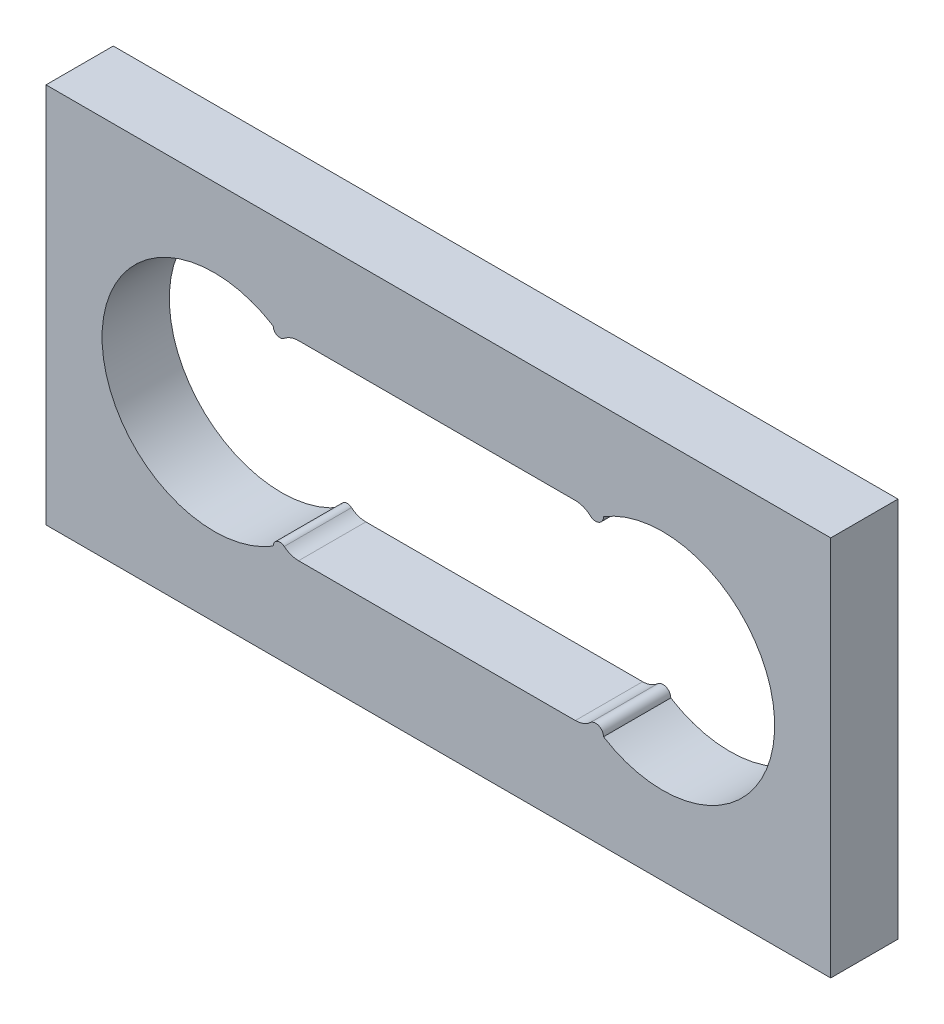
ISO-10303-21;
HEADER;
FILE_DESCRIPTION(('STEP AP214'),'2;1');
FILE_NAME('part.step','',(''),(''),'','','');
FILE_SCHEMA(('AUTOMOTIVE_DESIGN { 1 0 10303 214 1 1 1 1 }'));
ENDSEC;
DATA;
#1=APPLICATION_CONTEXT('core data for automotive mechanical design processes');
#2=APPLICATION_PROTOCOL_DEFINITION('international standard','automotive_design',2000,#1);
#3=PRODUCT_CONTEXT('',#1,'mechanical');
#4=PRODUCT('Part','Part','',(#3));
#5=PRODUCT_RELATED_PRODUCT_CATEGORY('part','',(#4));
#6=PRODUCT_DEFINITION_FORMATION('','',#4);
#7=PRODUCT_DEFINITION_CONTEXT('part definition',#1,'design');
#8=PRODUCT_DEFINITION('design','',#6,#7);
#9=PRODUCT_DEFINITION_SHAPE('','',#8);
#10=(LENGTH_UNIT() NAMED_UNIT(*) SI_UNIT(.MILLI.,.METRE.));
#11=(NAMED_UNIT(*) PLANE_ANGLE_UNIT() SI_UNIT($,.RADIAN.));
#12=(NAMED_UNIT(*) SI_UNIT($,.STERADIAN.) SOLID_ANGLE_UNIT());
#13=UNCERTAINTY_MEASURE_WITH_UNIT(LENGTH_MEASURE(1.E-05),#10,'distance_accuracy_value','');
#14=(GEOMETRIC_REPRESENTATION_CONTEXT(3) GLOBAL_UNCERTAINTY_ASSIGNED_CONTEXT((#13)) GLOBAL_UNIT_ASSIGNED_CONTEXT((#10,
#11,#12)) REPRESENTATION_CONTEXT('',''));
#15=CARTESIAN_POINT('',(0.,0.,0.));
#16=DIRECTION('',(0.,0.,1.));
#17=DIRECTION('',(1.,0.,0.));
#18=AXIS2_PLACEMENT_3D('',#15,#16,#17);
#19=CARTESIAN_POINT('',(0.,-8.5,3.));
#20=DIRECTION('',(0.,1.,0.));
#21=DIRECTION('',(0.,0.,1.));
#22=AXIS2_PLACEMENT_3D('',#19,#20,#21);
#23=PLANE('',#22);
#24=DIRECTION('',(1.,0.,0.));
#25=VECTOR('',#24,1.);
#26=CARTESIAN_POINT('',(0.,-8.5,0.));
#27=LINE('',#26,#25);
#28=CARTESIAN_POINT('',(-17.5,-8.5,0.));
#29=VERTEX_POINT('',#28);
#30=CARTESIAN_POINT('',(17.5,-8.5,0.));
#31=VERTEX_POINT('',#30);
#32=EDGE_CURVE('E204',#29,#31,#27,.T.);
#33=ORIENTED_EDGE('',*,*,#32,.T.);
#34=DIRECTION('',(0.,0.,-1.));
#35=VECTOR('',#34,1.);
#36=CARTESIAN_POINT('',(17.5,-8.5,3.));
#37=LINE('',#36,#35);
#38=CARTESIAN_POINT('',(17.5,-8.5,3.));
#39=VERTEX_POINT('',#38);
#40=EDGE_CURVE('E230',#39,#31,#37,.T.);
#41=ORIENTED_EDGE('',*,*,#40,.F.);
#42=DIRECTION('',(1.,0.,0.));
#43=VECTOR('',#42,1.);
#44=CARTESIAN_POINT('',(0.,-8.5,3.));
#45=LINE('',#44,#43);
#46=CARTESIAN_POINT('',(-17.5,-8.5,3.));
#47=VERTEX_POINT('',#46);
#48=EDGE_CURVE('E294',#47,#39,#45,.T.);
#49=ORIENTED_EDGE('',*,*,#48,.F.);
#50=DIRECTION('',(0.,0.,-1.));
#51=VECTOR('',#50,1.);
#52=CARTESIAN_POINT('',(-17.5,-8.5,3.));
#53=LINE('',#52,#51);
#54=EDGE_CURVE('E220',#47,#29,#53,.T.);
#55=ORIENTED_EDGE('',*,*,#54,.T.);
#56=EDGE_LOOP('',(#33,#41,#49,#55));
#57=FACE_BOUND('',#56,.T.);
#58=ADVANCED_FACE('F41',(#57),#23,.F.);
#59=CARTESIAN_POINT('',(17.5,0.,3.));
#60=DIRECTION('',(-1.,0.,0.));
#61=DIRECTION('',(0.,0.,1.));
#62=AXIS2_PLACEMENT_3D('',#59,#60,#61);
#63=PLANE('',#62);
#64=DIRECTION('',(0.,1.,0.));
#65=VECTOR('',#64,1.);
#66=CARTESIAN_POINT('',(17.5,0.,0.));
#67=LINE('',#66,#65);
#68=CARTESIAN_POINT('',(17.5,8.5,0.));
#69=VERTEX_POINT('',#68);
#70=EDGE_CURVE('E208',#31,#69,#67,.T.);
#71=ORIENTED_EDGE('',*,*,#70,.T.);
#72=DIRECTION('',(0.,0.,-1.));
#73=VECTOR('',#72,1.);
#74=CARTESIAN_POINT('',(17.5,8.5,3.));
#75=LINE('',#74,#73);
#76=CARTESIAN_POINT('',(17.5,8.5,3.));
#77=VERTEX_POINT('',#76);
#78=EDGE_CURVE('E227',#77,#69,#75,.T.);
#79=ORIENTED_EDGE('',*,*,#78,.F.);
#80=DIRECTION('',(0.,1.,0.));
#81=VECTOR('',#80,1.);
#82=CARTESIAN_POINT('',(17.5,0.,3.));
#83=LINE('',#82,#81);
#84=EDGE_CURVE('E292',#39,#77,#83,.T.);
#85=ORIENTED_EDGE('',*,*,#84,.F.);
#86=ORIENTED_EDGE('',*,*,#40,.T.);
#87=EDGE_LOOP('',(#71,#79,#85,#86));
#88=FACE_BOUND('',#87,.T.);
#89=ADVANCED_FACE('F376',(#88),#63,.F.);
#90=CARTESIAN_POINT('',(0.,8.5,3.));
#91=DIRECTION('',(0.,1.,0.));
#92=DIRECTION('',(0.,0.,1.));
#93=AXIS2_PLACEMENT_3D('',#90,#91,#92);
#94=PLANE('',#93);
#95=DIRECTION('',(1.,0.,0.));
#96=VECTOR('',#95,1.);
#97=CARTESIAN_POINT('',(0.,8.5,0.));
#98=LINE('',#97,#96);
#99=CARTESIAN_POINT('',(-17.5,8.5,0.));
#100=VERTEX_POINT('',#99);
#101=EDGE_CURVE('E212',#100,#69,#98,.T.);
#102=ORIENTED_EDGE('',*,*,#101,.F.);
#103=DIRECTION('',(0.,0.,-1.));
#104=VECTOR('',#103,1.);
#105=CARTESIAN_POINT('',(-17.5,8.5,3.));
#106=LINE('',#105,#104);
#107=CARTESIAN_POINT('',(-17.5,8.5,3.));
#108=VERTEX_POINT('',#107);
#109=EDGE_CURVE('E223',#108,#100,#106,.T.);
#110=ORIENTED_EDGE('',*,*,#109,.F.);
#111=DIRECTION('',(1.,0.,0.));
#112=VECTOR('',#111,1.);
#113=CARTESIAN_POINT('',(0.,8.5,3.));
#114=LINE('',#113,#112);
#115=EDGE_CURVE('E289',#108,#77,#114,.T.);
#116=ORIENTED_EDGE('',*,*,#115,.T.);
#117=ORIENTED_EDGE('',*,*,#78,.T.);
#118=EDGE_LOOP('',(#102,#110,#116,#117));
#119=FACE_BOUND('',#118,.T.);
#120=ADVANCED_FACE('F382',(#119),#94,.T.);
#121=CARTESIAN_POINT('',(10.,0.,3.));
#122=DIRECTION('',(0.,0.,-1.));
#123=DIRECTION('',(-1.,0.,0.));
#124=AXIS2_PLACEMENT_3D('',#121,#122,#123);
#125=CYLINDRICAL_SURFACE('',#124,5.);
#126=CARTESIAN_POINT('',(10.,0.,0.));
#127=DIRECTION('',(0.,0.,1.));
#128=DIRECTION('',(1.,0.,0.));
#129=AXIS2_PLACEMENT_3D('',#126,#127,#128);
#130=CIRCLE('',#129,5.);
#131=CARTESIAN_POINT('',(7.36608656178682,-4.25,0.));
#132=VERTEX_POINT('',#131);
#133=CARTESIAN_POINT('',(7.36608656178681,4.25,0.));
#134=VERTEX_POINT('',#133);
#135=EDGE_CURVE('E171',#132,#134,#130,.T.);
#136=ORIENTED_EDGE('',*,*,#135,.F.);
#137=DIRECTION('',(0.,0.,-1.));
#138=VECTOR('',#137,1.);
#139=CARTESIAN_POINT('',(7.36608656178682,-4.25,3.));
#140=LINE('',#139,#138);
#141=CARTESIAN_POINT('',(7.36608656178682,-4.25,3.));
#142=VERTEX_POINT('',#141);
#143=EDGE_CURVE('E224',#142,#132,#140,.T.);
#144=ORIENTED_EDGE('',*,*,#143,.F.);
#145=CARTESIAN_POINT('',(10.,0.,3.));
#146=DIRECTION('',(0.,0.,1.));
#147=DIRECTION('',(1.,0.,0.));
#148=AXIS2_PLACEMENT_3D('',#145,#146,#147);
#149=CIRCLE('',#148,5.);
#150=CARTESIAN_POINT('',(7.36608656178681,4.25,3.));
#151=VERTEX_POINT('',#150);
#152=EDGE_CURVE('E173',#142,#151,#149,.T.);
#153=ORIENTED_EDGE('',*,*,#152,.T.);
#154=DIRECTION('',(0.,0.,-1.));
#155=VECTOR('',#154,1.);
#156=CARTESIAN_POINT('',(7.36608656178681,4.25,3.));
#157=LINE('',#156,#155);
#158=EDGE_CURVE('E158',#151,#134,#157,.T.);
#159=ORIENTED_EDGE('',*,*,#158,.T.);
#160=EDGE_LOOP('',(#136,#144,#153,#159));
#161=FACE_BOUND('',#160,.T.);
#162=ADVANCED_FACE('F169',(#161),#125,.F.);
#163=CARTESIAN_POINT('',(0.,-4.25,3.));
#164=DIRECTION('',(0.,1.,0.));
#165=DIRECTION('',(0.,0.,1.));
#166=AXIS2_PLACEMENT_3D('',#163,#164,#165);
#167=PLANE('',#166);
#168=DIRECTION('',(1.,0.,0.));
#169=VECTOR('',#168,1.);
#170=CARTESIAN_POINT('',(0.,-4.25,3.));
#171=LINE('',#170,#169);
#172=CARTESIAN_POINT('',(-6.23542417549501,-4.25,3.));
#173=VERTEX_POINT('',#172);
#174=CARTESIAN_POINT('',(6.10916870442597,-4.25,3.));
#175=VERTEX_POINT('',#174);
#176=EDGE_CURVE('E306',#173,#175,#171,.T.);
#177=ORIENTED_EDGE('',*,*,#176,.T.);
#178=DIRECTION('',(0.,0.,-1.));
#179=VECTOR('',#178,1.);
#180=CARTESIAN_POINT('',(6.10916870442597,-4.25,0.));
#181=LINE('',#180,#179);
#182=CARTESIAN_POINT('',(6.10916870442597,-4.25,0.));
#183=VERTEX_POINT('',#182);
#184=EDGE_CURVE('E259',#175,#183,#181,.T.);
#185=ORIENTED_EDGE('',*,*,#184,.T.);
#186=DIRECTION('',(1.,0.,0.));
#187=VECTOR('',#186,1.);
#188=CARTESIAN_POINT('',(0.,-4.25,0.));
#189=LINE('',#188,#187);
#190=CARTESIAN_POINT('',(-6.23542417549501,-4.25,0.));
#191=VERTEX_POINT('',#190);
#192=EDGE_CURVE('E184',#191,#183,#189,.T.);
#193=ORIENTED_EDGE('',*,*,#192,.F.);
#194=DIRECTION('',(0.,0.,-1.));
#195=VECTOR('',#194,1.);
#196=CARTESIAN_POINT('',(-6.23542417549501,-4.25,3.));
#197=LINE('',#196,#195);
#198=EDGE_CURVE('E256',#191,#173,#197,.F.);
#199=ORIENTED_EDGE('',*,*,#198,.T.);
#200=EDGE_LOOP('',(#177,#185,#193,#199));
#201=FACE_BOUND('',#200,.T.);
#202=ADVANCED_FACE('F358',(#201),#167,.T.);
#203=CARTESIAN_POINT('',(-10.,0.,3.));
#204=DIRECTION('',(0.,0.,-1.));
#205=DIRECTION('',(-1.,0.,0.));
#206=AXIS2_PLACEMENT_3D('',#203,#204,#205);
#207=CYLINDRICAL_SURFACE('',#206,5.);
#208=CARTESIAN_POINT('',(-10.,0.,0.));
#209=DIRECTION('',(0.,0.,1.));
#210=DIRECTION('',(1.,0.,0.));
#211=AXIS2_PLACEMENT_3D('',#208,#209,#210);
#212=CIRCLE('',#211,5.);
#213=CARTESIAN_POINT('',(-7.36608656178681,4.25,0.));
#214=VERTEX_POINT('',#213);
#215=CARTESIAN_POINT('',(-7.36608656178682,-4.25,0.));
#216=VERTEX_POINT('',#215);
#217=EDGE_CURVE('E190',#214,#216,#212,.T.);
#218=ORIENTED_EDGE('',*,*,#217,.F.);
#219=DIRECTION('',(0.,0.,-1.));
#220=VECTOR('',#219,1.);
#221=CARTESIAN_POINT('',(-7.36608656178681,4.25,3.));
#222=LINE('',#221,#220);
#223=CARTESIAN_POINT('',(-7.36608656178681,4.25,3.));
#224=VERTEX_POINT('',#223);
#225=EDGE_CURVE('E175',#224,#214,#222,.T.);
#226=ORIENTED_EDGE('',*,*,#225,.F.);
#227=CARTESIAN_POINT('',(-10.,0.,3.));
#228=DIRECTION('',(0.,0.,1.));
#229=DIRECTION('',(1.,0.,0.));
#230=AXIS2_PLACEMENT_3D('',#227,#228,#229);
#231=CIRCLE('',#230,5.);
#232=CARTESIAN_POINT('',(-7.36608656178682,-4.25,3.));
#233=VERTEX_POINT('',#232);
#234=EDGE_CURVE('E302',#224,#233,#231,.T.);
#235=ORIENTED_EDGE('',*,*,#234,.T.);
#236=DIRECTION('',(0.,0.,-1.));
#237=VECTOR('',#236,1.);
#238=CARTESIAN_POINT('',(-7.36608656178682,-4.25,3.));
#239=LINE('',#238,#237);
#240=EDGE_CURVE('E237',#233,#216,#239,.T.);
#241=ORIENTED_EDGE('',*,*,#240,.T.);
#242=EDGE_LOOP('',(#218,#226,#235,#241));
#243=FACE_BOUND('',#242,.T.);
#244=ADVANCED_FACE('F344',(#243),#207,.F.);
#245=CARTESIAN_POINT('',(0.,4.25,3.));
#246=DIRECTION('',(0.,1.,0.));
#247=DIRECTION('',(0.,0.,1.));
#248=AXIS2_PLACEMENT_3D('',#245,#246,#247);
#249=PLANE('',#248);
#250=DIRECTION('',(1.,0.,0.));
#251=VECTOR('',#250,1.);
#252=CARTESIAN_POINT('',(0.,4.25,0.));
#253=LINE('',#252,#251);
#254=CARTESIAN_POINT('',(-6.235424175495,4.25,0.));
#255=VERTEX_POINT('',#254);
#256=CARTESIAN_POINT('',(6.10916870442596,4.25,0.));
#257=VERTEX_POINT('',#256);
#258=EDGE_CURVE('E200',#255,#257,#253,.T.);
#259=ORIENTED_EDGE('',*,*,#258,.T.);
#260=DIRECTION('',(0.,0.,1.));
#261=VECTOR('',#260,1.);
#262=CARTESIAN_POINT('',(6.10916870442596,4.25,3.));
#263=LINE('',#262,#261);
#264=CARTESIAN_POINT('',(6.10916870442596,4.25,3.));
#265=VERTEX_POINT('',#264);
#266=EDGE_CURVE('E246',#257,#265,#263,.T.);
#267=ORIENTED_EDGE('',*,*,#266,.T.);
#268=DIRECTION('',(1.,0.,0.));
#269=VECTOR('',#268,1.);
#270=CARTESIAN_POINT('',(0.,4.25,3.));
#271=LINE('',#270,#269);
#272=CARTESIAN_POINT('',(-6.235424175495,4.25,3.));
#273=VERTEX_POINT('',#272);
#274=EDGE_CURVE('E298',#273,#265,#271,.T.);
#275=ORIENTED_EDGE('',*,*,#274,.F.);
#276=DIRECTION('',(0.,0.,1.));
#277=VECTOR('',#276,1.);
#278=CARTESIAN_POINT('',(-6.235424175495,4.25,3.));
#279=LINE('',#278,#277);
#280=EDGE_CURVE('E233',#273,#255,#279,.F.);
#281=ORIENTED_EDGE('',*,*,#280,.T.);
#282=EDGE_LOOP('',(#259,#267,#275,#281));
#283=FACE_BOUND('',#282,.T.);
#284=ADVANCED_FACE('F334',(#283),#249,.F.);
#285=CARTESIAN_POINT('',(-17.5,0.,3.));
#286=DIRECTION('',(-1.,0.,0.));
#287=DIRECTION('',(0.,0.,1.));
#288=AXIS2_PLACEMENT_3D('',#285,#286,#287);
#289=PLANE('',#288);
#290=DIRECTION('',(0.,1.,0.));
#291=VECTOR('',#290,1.);
#292=CARTESIAN_POINT('',(-17.5,0.,0.));
#293=LINE('',#292,#291);
#294=EDGE_CURVE('E216',#29,#100,#293,.T.);
#295=ORIENTED_EDGE('',*,*,#294,.F.);
#296=ORIENTED_EDGE('',*,*,#54,.F.);
#297=DIRECTION('',(0.,1.,0.));
#298=VECTOR('',#297,1.);
#299=CARTESIAN_POINT('',(-17.5,0.,3.));
#300=LINE('',#299,#298);
#301=EDGE_CURVE('E176',#47,#108,#300,.T.);
#302=ORIENTED_EDGE('',*,*,#301,.T.);
#303=ORIENTED_EDGE('',*,*,#109,.T.);
#304=EDGE_LOOP('',(#295,#296,#302,#303));
#305=FACE_BOUND('',#304,.T.);
#306=ADVANCED_FACE('F389',(#305),#289,.T.);
#307=CARTESIAN_POINT('',(0.,0.,3.));
#308=DIRECTION('',(0.,0.,1.));
#309=DIRECTION('',(1.,0.,0.));
#310=AXIS2_PLACEMENT_3D('',#307,#308,#309);
#311=PLANE('',#310);
#312=CARTESIAN_POINT('',(-7.06608656178681,4.25,3.));
#313=DIRECTION('',(0.,0.,1.));
#314=DIRECTION('',(1.,0.,0.));
#315=AXIS2_PLACEMENT_3D('',#312,#313,#314);
#316=CIRCLE('',#315,0.3);
#317=CARTESIAN_POINT('',(-6.87439524187331,4.01923076923077,3.));
#318=VERTEX_POINT('',#317);
#319=EDGE_CURVE('E192',#224,#318,#316,.T.);
#320=ORIENTED_EDGE('',*,*,#319,.T.);
#321=CARTESIAN_POINT('',(-6.235424175495,3.25,3.));
#322=DIRECTION('',(0.,0.,1.));
#323=DIRECTION('',(1.,0.,0.));
#324=AXIS2_PLACEMENT_3D('',#321,#322,#323);
#325=CIRCLE('',#324,1.);
#326=EDGE_CURVE('E11',#318,#273,#325,.F.);
#327=ORIENTED_EDGE('',*,*,#326,.T.);
#328=ORIENTED_EDGE('',*,*,#274,.T.);
#329=CARTESIAN_POINT('',(6.10916870442596,3.25,3.));
#330=DIRECTION('',(0.,0.,1.));
#331=DIRECTION('',(1.,0.,0.));
#332=AXIS2_PLACEMENT_3D('',#329,#330,#331);
#333=CIRCLE('',#332,1.);
#334=CARTESIAN_POINT('',(6.78095970987844,3.99074074074074,3.));
#335=VERTEX_POINT('',#334);
#336=EDGE_CURVE('E268',#265,#335,#333,.F.);
#337=ORIENTED_EDGE('',*,*,#336,.T.);
#338=CARTESIAN_POINT('',(7.01608656178681,4.25,3.));
#339=DIRECTION('',(0.,0.,1.));
#340=DIRECTION('',(1.,0.,0.));
#341=AXIS2_PLACEMENT_3D('',#338,#339,#340);
#342=CIRCLE('',#341,0.35);
#343=EDGE_CURVE('E166',#335,#151,#342,.T.);
#344=ORIENTED_EDGE('',*,*,#343,.T.);
#345=ORIENTED_EDGE('',*,*,#152,.F.);
#346=CARTESIAN_POINT('',(7.01608656178682,-4.25,3.));
#347=DIRECTION('',(0.,0.,1.));
#348=DIRECTION('',(1.,0.,0.));
#349=AXIS2_PLACEMENT_3D('',#346,#347,#348);
#350=CIRCLE('',#349,0.35);
#351=CARTESIAN_POINT('',(6.78095970987845,-3.99074074074074,3.));
#352=VERTEX_POINT('',#351);
#353=EDGE_CURVE('E165',#142,#352,#350,.T.);
#354=ORIENTED_EDGE('',*,*,#353,.T.);
#355=CARTESIAN_POINT('',(6.10916870442597,-3.25,3.));
#356=DIRECTION('',(0.,0.,1.));
#357=DIRECTION('',(1.,0.,0.));
#358=AXIS2_PLACEMENT_3D('',#355,#356,#357);
#359=CIRCLE('',#358,1.);
#360=EDGE_CURVE('E274',#352,#175,#359,.F.);
#361=ORIENTED_EDGE('',*,*,#360,.T.);
#362=ORIENTED_EDGE('',*,*,#176,.F.);
#363=CARTESIAN_POINT('',(-6.23542417549501,-3.25,3.));
#364=DIRECTION('',(0.,0.,1.));
#365=DIRECTION('',(1.,0.,0.));
#366=AXIS2_PLACEMENT_3D('',#363,#364,#365);
#367=CIRCLE('',#366,1.);
#368=CARTESIAN_POINT('',(-6.87439524187333,-4.01923076923077,3.));
#369=VERTEX_POINT('',#368);
#370=EDGE_CURVE('E283',#173,#369,#367,.F.);
#371=ORIENTED_EDGE('',*,*,#370,.T.);
#372=CARTESIAN_POINT('',(-7.06608656178682,-4.25,3.));
#373=DIRECTION('',(0.,0.,1.));
#374=DIRECTION('',(1.,0.,0.));
#375=AXIS2_PLACEMENT_3D('',#372,#373,#374);
#376=CIRCLE('',#375,0.3);
#377=EDGE_CURVE('E316',#369,#233,#376,.T.);
#378=ORIENTED_EDGE('',*,*,#377,.T.);
#379=ORIENTED_EDGE('',*,*,#234,.F.);
#380=EDGE_LOOP('',(#320,#327,#328,#337,#344,#345,#354,#361,#362,#371,#378,#379));
#381=FACE_BOUND('',#380,.T.);
#382=ORIENTED_EDGE('',*,*,#48,.T.);
#383=ORIENTED_EDGE('',*,*,#84,.T.);
#384=ORIENTED_EDGE('',*,*,#115,.F.);
#385=ORIENTED_EDGE('',*,*,#301,.F.);
#386=EDGE_LOOP('',(#382,#383,#384,#385));
#387=FACE_BOUND('',#386,.T.);
#388=ADVANCED_FACE('F328',(#381,#387),#311,.T.);
#389=CARTESIAN_POINT('',(0.,0.,0.));
#390=DIRECTION('',(0.,0.,1.));
#391=DIRECTION('',(1.,0.,0.));
#392=AXIS2_PLACEMENT_3D('',#389,#390,#391);
#393=PLANE('',#392);
#394=ORIENTED_EDGE('',*,*,#135,.T.);
#395=CARTESIAN_POINT('',(7.01608656178681,4.25,0.));
#396=DIRECTION('',(0.,0.,1.));
#397=DIRECTION('',(1.,0.,0.));
#398=AXIS2_PLACEMENT_3D('',#395,#396,#397);
#399=CIRCLE('',#398,0.35);
#400=CARTESIAN_POINT('',(6.78095970987844,3.99074074074074,0.));
#401=VERTEX_POINT('',#400);
#402=EDGE_CURVE('E154',#401,#134,#399,.T.);
#403=ORIENTED_EDGE('',*,*,#402,.F.);
#404=CARTESIAN_POINT('',(6.10916870442596,3.25,0.));
#405=DIRECTION('',(0.,0.,1.));
#406=DIRECTION('',(1.,0.,0.));
#407=AXIS2_PLACEMENT_3D('',#404,#405,#406);
#408=CIRCLE('',#407,1.);
#409=EDGE_CURVE('E271',#401,#257,#408,.T.);
#410=ORIENTED_EDGE('',*,*,#409,.T.);
#411=ORIENTED_EDGE('',*,*,#258,.F.);
#412=CARTESIAN_POINT('',(-6.235424175495,3.25,0.));
#413=DIRECTION('',(0.,0.,1.));
#414=DIRECTION('',(1.,0.,0.));
#415=AXIS2_PLACEMENT_3D('',#412,#413,#414);
#416=CIRCLE('',#415,1.);
#417=CARTESIAN_POINT('',(-6.87439524187331,4.01923076923077,0.));
#418=VERTEX_POINT('',#417);
#419=EDGE_CURVE('E50',#255,#418,#416,.T.);
#420=ORIENTED_EDGE('',*,*,#419,.T.);
#421=CARTESIAN_POINT('',(-7.06608656178681,4.25,0.));
#422=DIRECTION('',(0.,0.,1.));
#423=DIRECTION('',(1.,0.,0.));
#424=AXIS2_PLACEMENT_3D('',#421,#422,#423);
#425=CIRCLE('',#424,0.3);
#426=EDGE_CURVE('E185',#214,#418,#425,.T.);
#427=ORIENTED_EDGE('',*,*,#426,.F.);
#428=ORIENTED_EDGE('',*,*,#217,.T.);
#429=CARTESIAN_POINT('',(-7.06608656178682,-4.25,0.));
#430=DIRECTION('',(0.,0.,1.));
#431=DIRECTION('',(1.,0.,0.));
#432=AXIS2_PLACEMENT_3D('',#429,#430,#431);
#433=CIRCLE('',#432,0.3);
#434=CARTESIAN_POINT('',(-6.87439524187333,-4.01923076923077,0.));
#435=VERTEX_POINT('',#434);
#436=EDGE_CURVE('E314',#435,#216,#433,.T.);
#437=ORIENTED_EDGE('',*,*,#436,.F.);
#438=CARTESIAN_POINT('',(-6.23542417549501,-3.25,0.));
#439=DIRECTION('',(0.,0.,1.));
#440=DIRECTION('',(1.,0.,0.));
#441=AXIS2_PLACEMENT_3D('',#438,#439,#440);
#442=CIRCLE('',#441,1.);
#443=EDGE_CURVE('E280',#435,#191,#442,.T.);
#444=ORIENTED_EDGE('',*,*,#443,.T.);
#445=ORIENTED_EDGE('',*,*,#192,.T.);
#446=CARTESIAN_POINT('',(6.10916870442597,-3.25,0.));
#447=DIRECTION('',(0.,0.,1.));
#448=DIRECTION('',(1.,0.,0.));
#449=AXIS2_PLACEMENT_3D('',#446,#447,#448);
#450=CIRCLE('',#449,1.);
#451=CARTESIAN_POINT('',(6.78095970987845,-3.99074074074074,0.));
#452=VERTEX_POINT('',#451);
#453=EDGE_CURVE('E277',#183,#452,#450,.T.);
#454=ORIENTED_EDGE('',*,*,#453,.T.);
#455=CARTESIAN_POINT('',(7.01608656178682,-4.25,0.));
#456=DIRECTION('',(0.,0.,1.));
#457=DIRECTION('',(1.,0.,0.));
#458=AXIS2_PLACEMENT_3D('',#455,#456,#457);
#459=CIRCLE('',#458,0.35);
#460=EDGE_CURVE('E182',#132,#452,#459,.T.);
#461=ORIENTED_EDGE('',*,*,#460,.F.);
#462=EDGE_LOOP('',(#394,#403,#410,#411,#420,#427,#428,#437,#444,#445,#454,#461));
#463=FACE_BOUND('',#462,.T.);
#464=ORIENTED_EDGE('',*,*,#32,.F.);
#465=ORIENTED_EDGE('',*,*,#294,.T.);
#466=ORIENTED_EDGE('',*,*,#101,.T.);
#467=ORIENTED_EDGE('',*,*,#70,.F.);
#468=EDGE_LOOP('',(#464,#465,#466,#467));
#469=FACE_BOUND('',#468,.T.);
#470=ADVANCED_FACE('F179',(#463,#469),#393,.F.);
#471=CARTESIAN_POINT('',(-7.06608656178681,4.25,0.));
#472=DIRECTION('',(0.,0.,1.));
#473=DIRECTION('',(1.,0.,0.));
#474=AXIS2_PLACEMENT_3D('',#471,#472,#473);
#475=CYLINDRICAL_SURFACE('',#474,0.3);
#476=ORIENTED_EDGE('',*,*,#426,.T.);
#477=DIRECTION('',(0.,0.,1.));
#478=VECTOR('',#477,1.);
#479=CARTESIAN_POINT('',(-6.87439524187331,4.01923076923077,0.));
#480=LINE('',#479,#478);
#481=EDGE_CURVE('E57',#418,#318,#480,.T.);
#482=ORIENTED_EDGE('',*,*,#481,.T.);
#483=ORIENTED_EDGE('',*,*,#319,.F.);
#484=ORIENTED_EDGE('',*,*,#225,.T.);
#485=EDGE_LOOP('',(#476,#482,#483,#484));
#486=FACE_BOUND('',#485,.T.);
#487=ADVANCED_FACE('F341',(#486),#475,.T.);
#488=CARTESIAN_POINT('',(-7.06608656178682,-4.25,0.));
#489=DIRECTION('',(0.,0.,1.));
#490=DIRECTION('',(1.,0.,0.));
#491=AXIS2_PLACEMENT_3D('',#488,#489,#490);
#492=CYLINDRICAL_SURFACE('',#491,0.3);
#493=ORIENTED_EDGE('',*,*,#377,.F.);
#494=DIRECTION('',(0.,0.,1.));
#495=VECTOR('',#494,1.);
#496=CARTESIAN_POINT('',(-6.87439524187333,-4.01923076923077,0.));
#497=LINE('',#496,#495);
#498=EDGE_CURVE('E262',#369,#435,#497,.F.);
#499=ORIENTED_EDGE('',*,*,#498,.T.);
#500=ORIENTED_EDGE('',*,*,#436,.T.);
#501=ORIENTED_EDGE('',*,*,#240,.F.);
#502=EDGE_LOOP('',(#493,#499,#500,#501));
#503=FACE_BOUND('',#502,.T.);
#504=ADVANCED_FACE('F350',(#503),#492,.T.);
#505=CARTESIAN_POINT('',(7.01608656178682,-4.25,0.));
#506=DIRECTION('',(0.,0.,1.));
#507=DIRECTION('',(1.,0.,0.));
#508=AXIS2_PLACEMENT_3D('',#505,#506,#507);
#509=CYLINDRICAL_SURFACE('',#508,0.35);
#510=ORIENTED_EDGE('',*,*,#460,.T.);
#511=DIRECTION('',(0.,0.,1.));
#512=VECTOR('',#511,1.);
#513=CARTESIAN_POINT('',(6.78095970987845,-3.99074074074074,0.));
#514=LINE('',#513,#512);
#515=EDGE_CURVE('E252',#452,#352,#514,.T.);
#516=ORIENTED_EDGE('',*,*,#515,.T.);
#517=ORIENTED_EDGE('',*,*,#353,.F.);
#518=ORIENTED_EDGE('',*,*,#143,.T.);
#519=EDGE_LOOP('',(#510,#516,#517,#518));
#520=FACE_BOUND('',#519,.T.);
#521=ADVANCED_FACE('F366',(#520),#509,.T.);
#522=CARTESIAN_POINT('',(7.01608656178681,4.25,0.));
#523=DIRECTION('',(0.,0.,1.));
#524=DIRECTION('',(1.,0.,0.));
#525=AXIS2_PLACEMENT_3D('',#522,#523,#524);
#526=CYLINDRICAL_SURFACE('',#525,0.35);
#527=ORIENTED_EDGE('',*,*,#343,.F.);
#528=DIRECTION('',(0.,0.,1.));
#529=VECTOR('',#528,1.);
#530=CARTESIAN_POINT('',(6.78095970987844,3.99074074074074,0.));
#531=LINE('',#530,#529);
#532=EDGE_CURVE('E161',#335,#401,#531,.F.);
#533=ORIENTED_EDGE('',*,*,#532,.T.);
#534=ORIENTED_EDGE('',*,*,#402,.T.);
#535=ORIENTED_EDGE('',*,*,#158,.F.);
#536=EDGE_LOOP('',(#527,#533,#534,#535));
#537=FACE_BOUND('',#536,.T.);
#538=ADVANCED_FACE('F157',(#537),#526,.T.);
#539=CARTESIAN_POINT('',(6.10916870442596,3.25,0.));
#540=DIRECTION('',(0.,0.,1.));
#541=DIRECTION('',(1.,0.,0.));
#542=AXIS2_PLACEMENT_3D('',#539,#540,#541);
#543=CYLINDRICAL_SURFACE('',#542,1.);
#544=ORIENTED_EDGE('',*,*,#409,.F.);
#545=ORIENTED_EDGE('',*,*,#532,.F.);
#546=ORIENTED_EDGE('',*,*,#336,.F.);
#547=ORIENTED_EDGE('',*,*,#266,.F.);
#548=EDGE_LOOP('',(#544,#545,#546,#547));
#549=FACE_BOUND('',#548,.T.);
#550=ADVANCED_FACE('F331',(#549),#543,.F.);
#551=CARTESIAN_POINT('',(6.10916870442597,-3.25,0.));
#552=DIRECTION('',(0.,0.,1.));
#553=DIRECTION('',(1.,0.,0.));
#554=AXIS2_PLACEMENT_3D('',#551,#552,#553);
#555=CYLINDRICAL_SURFACE('',#554,1.);
#556=ORIENTED_EDGE('',*,*,#453,.F.);
#557=ORIENTED_EDGE('',*,*,#184,.F.);
#558=ORIENTED_EDGE('',*,*,#360,.F.);
#559=ORIENTED_EDGE('',*,*,#515,.F.);
#560=EDGE_LOOP('',(#556,#557,#558,#559));
#561=FACE_BOUND('',#560,.T.);
#562=ADVANCED_FACE('F364',(#561),#555,.F.);
#563=CARTESIAN_POINT('',(-6.23542417549501,-3.25,0.));
#564=DIRECTION('',(0.,0.,1.));
#565=DIRECTION('',(1.,0.,0.));
#566=AXIS2_PLACEMENT_3D('',#563,#564,#565);
#567=CYLINDRICAL_SURFACE('',#566,1.);
#568=ORIENTED_EDGE('',*,*,#370,.F.);
#569=ORIENTED_EDGE('',*,*,#198,.F.);
#570=ORIENTED_EDGE('',*,*,#443,.F.);
#571=ORIENTED_EDGE('',*,*,#498,.F.);
#572=EDGE_LOOP('',(#568,#569,#570,#571));
#573=FACE_BOUND('',#572,.T.);
#574=ADVANCED_FACE('F354',(#573),#567,.F.);
#575=CARTESIAN_POINT('',(-6.235424175495,3.25,0.));
#576=DIRECTION('',(0.,0.,1.));
#577=DIRECTION('',(1.,0.,0.));
#578=AXIS2_PLACEMENT_3D('',#575,#576,#577);
#579=CYLINDRICAL_SURFACE('',#578,1.);
#580=ORIENTED_EDGE('',*,*,#326,.F.);
#581=ORIENTED_EDGE('',*,*,#481,.F.);
#582=ORIENTED_EDGE('',*,*,#419,.F.);
#583=ORIENTED_EDGE('',*,*,#280,.F.);
#584=EDGE_LOOP('',(#580,#581,#582,#583));
#585=FACE_BOUND('',#584,.T.);
#586=ADVANCED_FACE('F43',(#585),#579,.F.);
#587=CLOSED_SHELL('',(#58,#89,#120,#162,#202,#244,#284,#306,#388,#470,#487,#504,#521,#538,#550,
#562,#574,#586));
#588=MANIFOLD_SOLID_BREP('B2',#587);
#589=ADVANCED_BREP_SHAPE_REPRESENTATION('',(#18,#588),#14);
#590=SHAPE_DEFINITION_REPRESENTATION(#9,#589);
ENDSEC;
END-ISO-10303-21;
